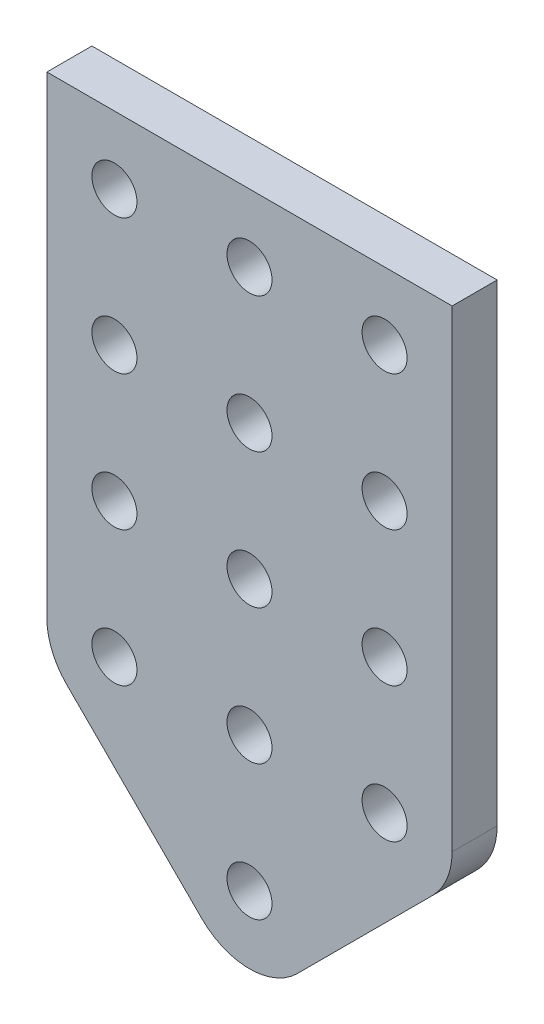
ISO-10303-21;
HEADER;
FILE_DESCRIPTION(('STEP AP214'),'2;1');
FILE_NAME('part.step','',(''),(''),'','','');
FILE_SCHEMA(('AUTOMOTIVE_DESIGN { 1 0 10303 214 1 1 1 1 }'));
ENDSEC;
DATA;
#1=APPLICATION_CONTEXT('core data for automotive mechanical design processes');
#2=APPLICATION_PROTOCOL_DEFINITION('international standard','automotive_design',2000,#1);
#3=PRODUCT_CONTEXT('',#1,'mechanical');
#4=PRODUCT('Part','Part','',(#3));
#5=PRODUCT_RELATED_PRODUCT_CATEGORY('part','',(#4));
#6=PRODUCT_DEFINITION_FORMATION('','',#4);
#7=PRODUCT_DEFINITION_CONTEXT('part definition',#1,'design');
#8=PRODUCT_DEFINITION('design','',#6,#7);
#9=PRODUCT_DEFINITION_SHAPE('','',#8);
#10=(LENGTH_UNIT() NAMED_UNIT(*) SI_UNIT(.MILLI.,.METRE.));
#11=(NAMED_UNIT(*) PLANE_ANGLE_UNIT() SI_UNIT($,.RADIAN.));
#12=(NAMED_UNIT(*) SI_UNIT($,.STERADIAN.) SOLID_ANGLE_UNIT());
#13=UNCERTAINTY_MEASURE_WITH_UNIT(LENGTH_MEASURE(1.E-05),#10,'distance_accuracy_value','');
#14=(GEOMETRIC_REPRESENTATION_CONTEXT(3) GLOBAL_UNCERTAINTY_ASSIGNED_CONTEXT((#13)) GLOBAL_UNIT_ASSIGNED_CONTEXT((#10,
#11,#12)) REPRESENTATION_CONTEXT('',''));
#15=CARTESIAN_POINT('',(0.,0.,0.));
#16=DIRECTION('',(0.,0.,1.));
#17=DIRECTION('',(1.,0.,0.));
#18=AXIS2_PLACEMENT_3D('',#15,#16,#17);
#19=CARTESIAN_POINT('',(187.7270545748,195.1787200631,3.));
#20=DIRECTION('',(0.,0.,1.));
#21=DIRECTION('',(1.,0.,0.));
#22=AXIS2_PLACEMENT_3D('',#19,#20,#21);
#23=PLANE('',#22);
#24=CARTESIAN_POINT('',(178.7270545748,231.1787200631,3.));
#25=DIRECTION('',(0.,0.,1.));
#26=DIRECTION('',(1.,0.,0.));
#27=AXIS2_PLACEMENT_3D('',#24,#25,#26);
#28=CIRCLE('',#27,1.5);
#29=CARTESIAN_POINT('',(180.2270545748,231.1787200631,3.));
#30=VERTEX_POINT('',#29);
#31=EDGE_CURVE('E242',#30,#30,#28,.T.);
#32=ORIENTED_EDGE('',*,*,#31,.F.);
#33=EDGE_LOOP('',(#32));
#34=FACE_BOUND('',#33,.T.);
#35=CARTESIAN_POINT('',(196.7270545748,222.1787200631,3.));
#36=DIRECTION('',(0.,0.,1.));
#37=DIRECTION('',(1.,0.,0.));
#38=AXIS2_PLACEMENT_3D('',#35,#36,#37);
#39=CIRCLE('',#38,1.5);
#40=CARTESIAN_POINT('',(198.2270545748,222.1787200631,3.));
#41=VERTEX_POINT('',#40);
#42=EDGE_CURVE('E230',#41,#41,#39,.T.);
#43=ORIENTED_EDGE('',*,*,#42,.F.);
#44=EDGE_LOOP('',(#43));
#45=FACE_BOUND('',#44,.T.);
#46=CARTESIAN_POINT('',(187.7270545748,222.1787200631,3.));
#47=DIRECTION('',(0.,0.,1.));
#48=DIRECTION('',(1.,0.,0.));
#49=AXIS2_PLACEMENT_3D('',#46,#47,#48);
#50=CIRCLE('',#49,1.5);
#51=CARTESIAN_POINT('',(189.2270545748,222.1787200631,3.));
#52=VERTEX_POINT('',#51);
#53=EDGE_CURVE('E218',#52,#52,#50,.T.);
#54=ORIENTED_EDGE('',*,*,#53,.F.);
#55=EDGE_LOOP('',(#54));
#56=FACE_BOUND('',#55,.T.);
#57=CARTESIAN_POINT('',(187.7270545748,195.1787200631,3.));
#58=DIRECTION('',(0.,0.,1.));
#59=DIRECTION('',(1.,0.,0.));
#60=AXIS2_PLACEMENT_3D('',#57,#58,#59);
#61=CIRCLE('',#60,1.5);
#62=CARTESIAN_POINT('',(189.2270545748,195.1787200631,3.));
#63=VERTEX_POINT('',#62);
#64=EDGE_CURVE('E206',#63,#63,#61,.T.);
#65=ORIENTED_EDGE('',*,*,#64,.F.);
#66=EDGE_LOOP('',(#65));
#67=FACE_BOUND('',#66,.T.);
#68=CARTESIAN_POINT('',(178.7270545748,213.1787200631,3.));
#69=DIRECTION('',(0.,0.,1.));
#70=DIRECTION('',(1.,0.,0.));
#71=AXIS2_PLACEMENT_3D('',#68,#69,#70);
#72=CIRCLE('',#71,1.5);
#73=CARTESIAN_POINT('',(180.2270545748,213.1787200631,3.));
#74=VERTEX_POINT('',#73);
#75=EDGE_CURVE('E194',#74,#74,#72,.T.);
#76=ORIENTED_EDGE('',*,*,#75,.F.);
#77=EDGE_LOOP('',(#76));
#78=FACE_BOUND('',#77,.T.);
#79=CARTESIAN_POINT('',(178.7270545748,204.1787200631,3.));
#80=DIRECTION('',(0.,0.,1.));
#81=DIRECTION('',(1.,0.,0.));
#82=AXIS2_PLACEMENT_3D('',#79,#80,#81);
#83=CIRCLE('',#82,1.5);
#84=CARTESIAN_POINT('',(180.2270545748,204.1787200631,3.));
#85=VERTEX_POINT('',#84);
#86=EDGE_CURVE('E182',#85,#85,#83,.T.);
#87=ORIENTED_EDGE('',*,*,#86,.F.);
#88=EDGE_LOOP('',(#87));
#89=FACE_BOUND('',#88,.T.);
#90=CARTESIAN_POINT('',(187.7270545748,195.1787200631,3.));
#91=DIRECTION('',(0.,0.,1.));
#92=DIRECTION('',(1.,0.,0.));
#93=AXIS2_PLACEMENT_3D('',#90,#91,#92);
#94=CIRCLE('',#93,4.50000000005025);
#95=CARTESIAN_POINT('',(184.5450740594,191.9967395477,3.));
#96=VERTEX_POINT('',#95);
#97=CARTESIAN_POINT('',(190.9090350901,191.9967395477,3.));
#98=VERTEX_POINT('',#97);
#99=EDGE_CURVE('E145',#96,#98,#94,.T.);
#100=ORIENTED_EDGE('',*,*,#99,.T.);
#101=DIRECTION('',(0.707106781186548,0.707106781186548,0.));
#102=VECTOR('',#101,1.);
#103=CARTESIAN_POINT('',(190.9090350901,191.9967395477,3.));
#104=LINE('',#103,#102);
#105=CARTESIAN_POINT('',(199.909035090095,200.996739547705,3.));
#106=VERTEX_POINT('',#105);
#107=EDGE_CURVE('E93',#98,#106,#104,.T.);
#108=ORIENTED_EDGE('',*,*,#107,.T.);
#109=CARTESIAN_POINT('',(196.7270545748,204.1787200631,3.));
#110=DIRECTION('',(0.,0.,1.));
#111=DIRECTION('',(1.,0.,0.));
#112=AXIS2_PLACEMENT_3D('',#109,#110,#111);
#113=CIRCLE('',#112,4.50000000000745);
#114=CARTESIAN_POINT('',(201.2270545748,204.1787200631,3.));
#115=VERTEX_POINT('',#114);
#116=EDGE_CURVE('E160',#106,#115,#113,.T.);
#117=ORIENTED_EDGE('',*,*,#116,.T.);
#118=DIRECTION('',(0.,1.,0.));
#119=VECTOR('',#118,1.);
#120=CARTESIAN_POINT('',(201.2270545748,235.6787200631,3.));
#121=LINE('',#120,#119);
#122=CARTESIAN_POINT('',(201.2270545748,235.6787200631,3.));
#123=VERTEX_POINT('',#122);
#124=EDGE_CURVE('E173',#115,#123,#121,.T.);
#125=ORIENTED_EDGE('',*,*,#124,.T.);
#126=DIRECTION('',(-1.,0.,0.));
#127=VECTOR('',#126,1.);
#128=CARTESIAN_POINT('',(201.2270545748,235.6787200631,3.));
#129=LINE('',#128,#127);
#130=CARTESIAN_POINT('',(174.2270545748,235.6787200631,3.));
#131=VERTEX_POINT('',#130);
#132=EDGE_CURVE('E112',#123,#131,#129,.T.);
#133=ORIENTED_EDGE('',*,*,#132,.T.);
#134=DIRECTION('',(0.,-1.,0.));
#135=VECTOR('',#134,1.);
#136=CARTESIAN_POINT('',(174.2270545748,213.1787200631,3.));
#137=LINE('',#136,#135);
#138=CARTESIAN_POINT('',(174.227054574757,204.1787200631,3.));
#139=VERTEX_POINT('',#138);
#140=EDGE_CURVE('E106',#131,#139,#137,.T.);
#141=ORIENTED_EDGE('',*,*,#140,.T.);
#142=CARTESIAN_POINT('',(178.7270545748,204.1787200631,3.));
#143=DIRECTION('',(0.,0.,1.));
#144=DIRECTION('',(1.,0.,0.));
#145=AXIS2_PLACEMENT_3D('',#142,#143,#144);
#146=CIRCLE('',#145,4.50000000004281);
#147=CARTESIAN_POINT('',(175.5450740594,200.9967395477,3.));
#148=VERTEX_POINT('',#147);
#149=EDGE_CURVE('E110',#139,#148,#146,.T.);
#150=ORIENTED_EDGE('',*,*,#149,.T.);
#151=DIRECTION('',(0.707106781186548,-0.707106781186548,0.));
#152=VECTOR('',#151,1.);
#153=CARTESIAN_POINT('',(184.5450740594,191.9967395477,3.));
#154=LINE('',#153,#152);
#155=EDGE_CURVE('E50',#148,#96,#154,.T.);
#156=ORIENTED_EDGE('',*,*,#155,.T.);
#157=EDGE_LOOP('',(#100,#108,#117,#125,#133,#141,#150,#156));
#158=FACE_BOUND('',#157,.T.);
#159=CARTESIAN_POINT('',(187.7270545748,204.1787200631,3.));
#160=DIRECTION('',(0.,0.,1.));
#161=DIRECTION('',(1.,0.,0.));
#162=AXIS2_PLACEMENT_3D('',#159,#160,#161);
#163=CIRCLE('',#162,1.5);
#164=CARTESIAN_POINT('',(189.2270545748,204.1787200631,3.));
#165=VERTEX_POINT('',#164);
#166=EDGE_CURVE('E133',#165,#165,#163,.T.);
#167=ORIENTED_EDGE('',*,*,#166,.F.);
#168=EDGE_LOOP('',(#167));
#169=FACE_BOUND('',#168,.T.);
#170=CARTESIAN_POINT('',(187.7270545748,213.1787200631,3.));
#171=DIRECTION('',(0.,0.,1.));
#172=DIRECTION('',(1.,0.,0.));
#173=AXIS2_PLACEMENT_3D('',#170,#171,#172);
#174=CIRCLE('',#173,1.5);
#175=CARTESIAN_POINT('',(189.2270545748,213.1787200631,3.));
#176=VERTEX_POINT('',#175);
#177=EDGE_CURVE('E188',#176,#176,#174,.T.);
#178=ORIENTED_EDGE('',*,*,#177,.F.);
#179=EDGE_LOOP('',(#178));
#180=FACE_BOUND('',#179,.T.);
#181=CARTESIAN_POINT('',(196.7270545748,213.1787200631,3.));
#182=DIRECTION('',(0.,0.,1.));
#183=DIRECTION('',(1.,0.,0.));
#184=AXIS2_PLACEMENT_3D('',#181,#182,#183);
#185=CIRCLE('',#184,1.5);
#186=CARTESIAN_POINT('',(198.2270545748,213.1787200631,3.));
#187=VERTEX_POINT('',#186);
#188=EDGE_CURVE('E200',#187,#187,#185,.T.);
#189=ORIENTED_EDGE('',*,*,#188,.F.);
#190=EDGE_LOOP('',(#189));
#191=FACE_BOUND('',#190,.T.);
#192=CARTESIAN_POINT('',(196.7270545748,204.1787200631,3.));
#193=DIRECTION('',(0.,0.,1.));
#194=DIRECTION('',(1.,0.,0.));
#195=AXIS2_PLACEMENT_3D('',#192,#193,#194);
#196=CIRCLE('',#195,1.5);
#197=CARTESIAN_POINT('',(198.2270545748,204.1787200631,3.));
#198=VERTEX_POINT('',#197);
#199=EDGE_CURVE('E212',#198,#198,#196,.T.);
#200=ORIENTED_EDGE('',*,*,#199,.F.);
#201=EDGE_LOOP('',(#200));
#202=FACE_BOUND('',#201,.T.);
#203=CARTESIAN_POINT('',(178.7270545748,222.1787200631,3.));
#204=DIRECTION('',(0.,0.,1.));
#205=DIRECTION('',(1.,0.,0.));
#206=AXIS2_PLACEMENT_3D('',#203,#204,#205);
#207=CIRCLE('',#206,1.5);
#208=CARTESIAN_POINT('',(180.2270545748,222.1787200631,3.));
#209=VERTEX_POINT('',#208);
#210=EDGE_CURVE('E224',#209,#209,#207,.T.);
#211=ORIENTED_EDGE('',*,*,#210,.F.);
#212=EDGE_LOOP('',(#211));
#213=FACE_BOUND('',#212,.T.);
#214=CARTESIAN_POINT('',(187.7270545748,231.1787200631,3.));
#215=DIRECTION('',(0.,0.,1.));
#216=DIRECTION('',(1.,0.,0.));
#217=AXIS2_PLACEMENT_3D('',#214,#215,#216);
#218=CIRCLE('',#217,1.5);
#219=CARTESIAN_POINT('',(189.2270545748,231.1787200631,3.));
#220=VERTEX_POINT('',#219);
#221=EDGE_CURVE('E236',#220,#220,#218,.T.);
#222=ORIENTED_EDGE('',*,*,#221,.F.);
#223=EDGE_LOOP('',(#222));
#224=FACE_BOUND('',#223,.T.);
#225=CARTESIAN_POINT('',(196.7270545748,231.1787200631,3.));
#226=DIRECTION('',(0.,0.,1.));
#227=DIRECTION('',(1.,0.,0.));
#228=AXIS2_PLACEMENT_3D('',#225,#226,#227);
#229=CIRCLE('',#228,1.5);
#230=CARTESIAN_POINT('',(198.2270545748,231.1787200631,3.));
#231=VERTEX_POINT('',#230);
#232=EDGE_CURVE('E248',#231,#231,#229,.T.);
#233=ORIENTED_EDGE('',*,*,#232,.F.);
#234=EDGE_LOOP('',(#233));
#235=FACE_BOUND('',#234,.T.);
#236=ADVANCED_FACE('F33',(#34,#45,#56,#67,#78,#89,#158,#169,#180,#191,#202,#213,#224,#235),#23,.T.);
#237=CARTESIAN_POINT('',(187.7270545748,195.1787200631,0.));
#238=DIRECTION('',(0.,0.,1.));
#239=DIRECTION('',(1.,0.,0.));
#240=AXIS2_PLACEMENT_3D('',#237,#238,#239);
#241=PLANE('',#240);
#242=CARTESIAN_POINT('',(178.7270545748,231.1787200631,0.));
#243=DIRECTION('',(0.,0.,1.));
#244=DIRECTION('',(1.,0.,0.));
#245=AXIS2_PLACEMENT_3D('',#242,#243,#244);
#246=CIRCLE('',#245,1.5);
#247=CARTESIAN_POINT('',(180.2270545748,231.1787200631,0.));
#248=VERTEX_POINT('',#247);
#249=EDGE_CURVE('E245',#248,#248,#246,.T.);
#250=ORIENTED_EDGE('',*,*,#249,.T.);
#251=EDGE_LOOP('',(#250));
#252=FACE_BOUND('',#251,.T.);
#253=CARTESIAN_POINT('',(196.7270545748,222.1787200631,0.));
#254=DIRECTION('',(0.,0.,1.));
#255=DIRECTION('',(1.,0.,0.));
#256=AXIS2_PLACEMENT_3D('',#253,#254,#255);
#257=CIRCLE('',#256,1.5);
#258=CARTESIAN_POINT('',(198.2270545748,222.1787200631,0.));
#259=VERTEX_POINT('',#258);
#260=EDGE_CURVE('E233',#259,#259,#257,.T.);
#261=ORIENTED_EDGE('',*,*,#260,.T.);
#262=EDGE_LOOP('',(#261));
#263=FACE_BOUND('',#262,.T.);
#264=CARTESIAN_POINT('',(187.7270545748,222.1787200631,0.));
#265=DIRECTION('',(0.,0.,1.));
#266=DIRECTION('',(1.,0.,0.));
#267=AXIS2_PLACEMENT_3D('',#264,#265,#266);
#268=CIRCLE('',#267,1.5);
#269=CARTESIAN_POINT('',(189.2270545748,222.1787200631,0.));
#270=VERTEX_POINT('',#269);
#271=EDGE_CURVE('E221',#270,#270,#268,.T.);
#272=ORIENTED_EDGE('',*,*,#271,.T.);
#273=EDGE_LOOP('',(#272));
#274=FACE_BOUND('',#273,.T.);
#275=CARTESIAN_POINT('',(187.7270545748,195.1787200631,0.));
#276=DIRECTION('',(0.,0.,1.));
#277=DIRECTION('',(1.,0.,0.));
#278=AXIS2_PLACEMENT_3D('',#275,#276,#277);
#279=CIRCLE('',#278,1.5);
#280=CARTESIAN_POINT('',(189.2270545748,195.1787200631,0.));
#281=VERTEX_POINT('',#280);
#282=EDGE_CURVE('E209',#281,#281,#279,.T.);
#283=ORIENTED_EDGE('',*,*,#282,.T.);
#284=EDGE_LOOP('',(#283));
#285=FACE_BOUND('',#284,.T.);
#286=CARTESIAN_POINT('',(178.7270545748,213.1787200631,0.));
#287=DIRECTION('',(0.,0.,1.));
#288=DIRECTION('',(1.,0.,0.));
#289=AXIS2_PLACEMENT_3D('',#286,#287,#288);
#290=CIRCLE('',#289,1.5);
#291=CARTESIAN_POINT('',(180.2270545748,213.1787200631,0.));
#292=VERTEX_POINT('',#291);
#293=EDGE_CURVE('E197',#292,#292,#290,.T.);
#294=ORIENTED_EDGE('',*,*,#293,.T.);
#295=EDGE_LOOP('',(#294));
#296=FACE_BOUND('',#295,.T.);
#297=CARTESIAN_POINT('',(178.7270545748,204.1787200631,0.));
#298=DIRECTION('',(0.,0.,1.));
#299=DIRECTION('',(1.,0.,0.));
#300=AXIS2_PLACEMENT_3D('',#297,#298,#299);
#301=CIRCLE('',#300,1.5);
#302=CARTESIAN_POINT('',(180.2270545748,204.1787200631,0.));
#303=VERTEX_POINT('',#302);
#304=EDGE_CURVE('E185',#303,#303,#301,.T.);
#305=ORIENTED_EDGE('',*,*,#304,.T.);
#306=EDGE_LOOP('',(#305));
#307=FACE_BOUND('',#306,.T.);
#308=CARTESIAN_POINT('',(187.7270545748,195.1787200631,0.));
#309=DIRECTION('',(0.,0.,1.));
#310=DIRECTION('',(1.,0.,0.));
#311=AXIS2_PLACEMENT_3D('',#308,#309,#310);
#312=CIRCLE('',#311,4.50000000005025);
#313=CARTESIAN_POINT('',(184.5450740594,191.9967395477,0.));
#314=VERTEX_POINT('',#313);
#315=CARTESIAN_POINT('',(190.9090350901,191.9967395477,0.));
#316=VERTEX_POINT('',#315);
#317=EDGE_CURVE('E129',#314,#316,#312,.T.);
#318=ORIENTED_EDGE('',*,*,#317,.F.);
#319=DIRECTION('',(0.707106781186548,-0.707106781186548,0.));
#320=VECTOR('',#319,1.);
#321=CARTESIAN_POINT('',(184.5450740594,191.9967395477,0.));
#322=LINE('',#321,#320);
#323=CARTESIAN_POINT('',(175.5450740594,200.9967395477,0.));
#324=VERTEX_POINT('',#323);
#325=EDGE_CURVE('E85',#324,#314,#322,.T.);
#326=ORIENTED_EDGE('',*,*,#325,.F.);
#327=CARTESIAN_POINT('',(178.7270545748,204.1787200631,0.));
#328=DIRECTION('',(0.,0.,1.));
#329=DIRECTION('',(1.,0.,0.));
#330=AXIS2_PLACEMENT_3D('',#327,#328,#329);
#331=CIRCLE('',#330,4.50000000004281);
#332=CARTESIAN_POINT('',(174.227054574757,204.1787200631,0.));
#333=VERTEX_POINT('',#332);
#334=EDGE_CURVE('E79',#333,#324,#331,.T.);
#335=ORIENTED_EDGE('',*,*,#334,.F.);
#336=DIRECTION('',(0.,-1.,0.));
#337=VECTOR('',#336,1.);
#338=CARTESIAN_POINT('',(174.2270545748,213.1787200631,0.));
#339=LINE('',#338,#337);
#340=CARTESIAN_POINT('',(174.2270545748,235.6787200631,0.));
#341=VERTEX_POINT('',#340);
#342=EDGE_CURVE('E119',#341,#333,#339,.T.);
#343=ORIENTED_EDGE('',*,*,#342,.F.);
#344=DIRECTION('',(-1.,0.,0.));
#345=VECTOR('',#344,1.);
#346=CARTESIAN_POINT('',(201.2270545748,235.6787200631,0.));
#347=LINE('',#346,#345);
#348=CARTESIAN_POINT('',(201.2270545748,235.6787200631,0.));
#349=VERTEX_POINT('',#348);
#350=EDGE_CURVE('E139',#349,#341,#347,.T.);
#351=ORIENTED_EDGE('',*,*,#350,.F.);
#352=DIRECTION('',(0.,1.,0.));
#353=VECTOR('',#352,1.);
#354=CARTESIAN_POINT('',(201.2270545748,235.6787200631,0.));
#355=LINE('',#354,#353);
#356=CARTESIAN_POINT('',(201.2270545748,204.1787200631,0.));
#357=VERTEX_POINT('',#356);
#358=EDGE_CURVE('E137',#357,#349,#355,.T.);
#359=ORIENTED_EDGE('',*,*,#358,.F.);
#360=CARTESIAN_POINT('',(196.7270545748,204.1787200631,0.));
#361=DIRECTION('',(0.,0.,1.));
#362=DIRECTION('',(1.,0.,0.));
#363=AXIS2_PLACEMENT_3D('',#360,#361,#362);
#364=CIRCLE('',#363,4.50000000000745);
#365=CARTESIAN_POINT('',(199.909035090095,200.996739547705,0.));
#366=VERTEX_POINT('',#365);
#367=EDGE_CURVE('E135',#366,#357,#364,.T.);
#368=ORIENTED_EDGE('',*,*,#367,.F.);
#369=DIRECTION('',(0.707106781186548,0.707106781186548,0.));
#370=VECTOR('',#369,1.);
#371=CARTESIAN_POINT('',(190.9090350901,191.9967395477,0.));
#372=LINE('',#371,#370);
#373=EDGE_CURVE('E132',#316,#366,#372,.T.);
#374=ORIENTED_EDGE('',*,*,#373,.F.);
#375=EDGE_LOOP('',(#318,#326,#335,#343,#351,#359,#368,#374));
#376=FACE_BOUND('',#375,.T.);
#377=CARTESIAN_POINT('',(187.7270545748,204.1787200631,0.));
#378=DIRECTION('',(0.,0.,1.));
#379=DIRECTION('',(1.,0.,0.));
#380=AXIS2_PLACEMENT_3D('',#377,#378,#379);
#381=CIRCLE('',#380,1.5);
#382=CARTESIAN_POINT('',(189.2270545748,204.1787200631,0.));
#383=VERTEX_POINT('',#382);
#384=EDGE_CURVE('E179',#383,#383,#381,.T.);
#385=ORIENTED_EDGE('',*,*,#384,.T.);
#386=EDGE_LOOP('',(#385));
#387=FACE_BOUND('',#386,.T.);
#388=CARTESIAN_POINT('',(187.7270545748,213.1787200631,0.));
#389=DIRECTION('',(0.,0.,1.));
#390=DIRECTION('',(1.,0.,0.));
#391=AXIS2_PLACEMENT_3D('',#388,#389,#390);
#392=CIRCLE('',#391,1.5);
#393=CARTESIAN_POINT('',(189.2270545748,213.1787200631,0.));
#394=VERTEX_POINT('',#393);
#395=EDGE_CURVE('E191',#394,#394,#392,.T.);
#396=ORIENTED_EDGE('',*,*,#395,.T.);
#397=EDGE_LOOP('',(#396));
#398=FACE_BOUND('',#397,.T.);
#399=CARTESIAN_POINT('',(196.7270545748,213.1787200631,0.));
#400=DIRECTION('',(0.,0.,1.));
#401=DIRECTION('',(1.,0.,0.));
#402=AXIS2_PLACEMENT_3D('',#399,#400,#401);
#403=CIRCLE('',#402,1.5);
#404=CARTESIAN_POINT('',(198.2270545748,213.1787200631,0.));
#405=VERTEX_POINT('',#404);
#406=EDGE_CURVE('E203',#405,#405,#403,.T.);
#407=ORIENTED_EDGE('',*,*,#406,.T.);
#408=EDGE_LOOP('',(#407));
#409=FACE_BOUND('',#408,.T.);
#410=CARTESIAN_POINT('',(196.7270545748,204.1787200631,0.));
#411=DIRECTION('',(0.,0.,1.));
#412=DIRECTION('',(1.,0.,0.));
#413=AXIS2_PLACEMENT_3D('',#410,#411,#412);
#414=CIRCLE('',#413,1.5);
#415=CARTESIAN_POINT('',(198.2270545748,204.1787200631,0.));
#416=VERTEX_POINT('',#415);
#417=EDGE_CURVE('E215',#416,#416,#414,.T.);
#418=ORIENTED_EDGE('',*,*,#417,.T.);
#419=EDGE_LOOP('',(#418));
#420=FACE_BOUND('',#419,.T.);
#421=CARTESIAN_POINT('',(178.7270545748,222.1787200631,0.));
#422=DIRECTION('',(0.,0.,1.));
#423=DIRECTION('',(1.,0.,0.));
#424=AXIS2_PLACEMENT_3D('',#421,#422,#423);
#425=CIRCLE('',#424,1.5);
#426=CARTESIAN_POINT('',(180.2270545748,222.1787200631,0.));
#427=VERTEX_POINT('',#426);
#428=EDGE_CURVE('E227',#427,#427,#425,.T.);
#429=ORIENTED_EDGE('',*,*,#428,.T.);
#430=EDGE_LOOP('',(#429));
#431=FACE_BOUND('',#430,.T.);
#432=CARTESIAN_POINT('',(187.7270545748,231.1787200631,0.));
#433=DIRECTION('',(0.,0.,1.));
#434=DIRECTION('',(1.,0.,0.));
#435=AXIS2_PLACEMENT_3D('',#432,#433,#434);
#436=CIRCLE('',#435,1.5);
#437=CARTESIAN_POINT('',(189.2270545748,231.1787200631,0.));
#438=VERTEX_POINT('',#437);
#439=EDGE_CURVE('E239',#438,#438,#436,.T.);
#440=ORIENTED_EDGE('',*,*,#439,.T.);
#441=EDGE_LOOP('',(#440));
#442=FACE_BOUND('',#441,.T.);
#443=CARTESIAN_POINT('',(196.7270545748,231.1787200631,0.));
#444=DIRECTION('',(0.,0.,1.));
#445=DIRECTION('',(1.,0.,0.));
#446=AXIS2_PLACEMENT_3D('',#443,#444,#445);
#447=CIRCLE('',#446,1.5);
#448=CARTESIAN_POINT('',(198.2270545748,231.1787200631,0.));
#449=VERTEX_POINT('',#448);
#450=EDGE_CURVE('E251',#449,#449,#447,.T.);
#451=ORIENTED_EDGE('',*,*,#450,.T.);
#452=EDGE_LOOP('',(#451));
#453=FACE_BOUND('',#452,.T.);
#454=ADVANCED_FACE('F164',(#252,#263,#274,#285,#296,#307,#376,#387,#398,#409,#420,#431,#442,
#453),#241,.F.);
#455=CARTESIAN_POINT('',(187.7270545748,195.1787200631,3.));
#456=DIRECTION('',(0.,0.,-1.));
#457=DIRECTION('',(-1.,0.,0.));
#458=AXIS2_PLACEMENT_3D('',#455,#456,#457);
#459=CYLINDRICAL_SURFACE('',#458,4.50000000005025);
#460=ORIENTED_EDGE('',*,*,#317,.T.);
#461=DIRECTION('',(0.,0.,-1.));
#462=VECTOR('',#461,1.);
#463=CARTESIAN_POINT('',(190.9090350901,191.9967395477,3.));
#464=LINE('',#463,#462);
#465=EDGE_CURVE('E11',#98,#316,#464,.T.);
#466=ORIENTED_EDGE('',*,*,#465,.F.);
#467=ORIENTED_EDGE('',*,*,#99,.F.);
#468=DIRECTION('',(0.,0.,-1.));
#469=VECTOR('',#468,1.);
#470=CARTESIAN_POINT('',(184.5450740594,191.9967395477,3.));
#471=LINE('',#470,#469);
#472=EDGE_CURVE('E125',#96,#314,#471,.T.);
#473=ORIENTED_EDGE('',*,*,#472,.T.);
#474=EDGE_LOOP('',(#460,#466,#467,#473));
#475=FACE_BOUND('',#474,.T.);
#476=ADVANCED_FACE('F35',(#475),#459,.T.);
#477=CARTESIAN_POINT('',(190.9090350901,191.9967395477,3.));
#478=DIRECTION('',(-0.707106781186547,0.707106781186547,0.));
#479=DIRECTION('',(-0.707106781186548,-0.707106781186548,0.));
#480=AXIS2_PLACEMENT_3D('',#477,#478,#479);
#481=PLANE('',#480);
#482=ORIENTED_EDGE('',*,*,#373,.T.);
#483=DIRECTION('',(0.,0.,-1.));
#484=VECTOR('',#483,1.);
#485=CARTESIAN_POINT('',(199.909035090095,200.996739547705,3.));
#486=LINE('',#485,#484);
#487=EDGE_CURVE('E42',#106,#366,#486,.T.);
#488=ORIENTED_EDGE('',*,*,#487,.F.);
#489=ORIENTED_EDGE('',*,*,#107,.F.);
#490=ORIENTED_EDGE('',*,*,#465,.T.);
#491=EDGE_LOOP('',(#482,#488,#489,#490));
#492=FACE_BOUND('',#491,.T.);
#493=ADVANCED_FACE('F286',(#492),#481,.F.);
#494=CARTESIAN_POINT('',(196.7270545748,204.1787200631,3.));
#495=DIRECTION('',(0.,0.,-1.));
#496=DIRECTION('',(-1.,0.,0.));
#497=AXIS2_PLACEMENT_3D('',#494,#495,#496);
#498=CYLINDRICAL_SURFACE('',#497,4.50000000000745);
#499=ORIENTED_EDGE('',*,*,#367,.T.);
#500=DIRECTION('',(0.,0.,-1.));
#501=VECTOR('',#500,1.);
#502=CARTESIAN_POINT('',(201.2270545748,204.1787200631,3.));
#503=LINE('',#502,#501);
#504=EDGE_CURVE('E152',#115,#357,#503,.T.);
#505=ORIENTED_EDGE('',*,*,#504,.F.);
#506=ORIENTED_EDGE('',*,*,#116,.F.);
#507=ORIENTED_EDGE('',*,*,#487,.T.);
#508=EDGE_LOOP('',(#499,#505,#506,#507));
#509=FACE_BOUND('',#508,.T.);
#510=ADVANCED_FACE('F158',(#509),#498,.T.);
#511=CARTESIAN_POINT('',(201.2270545748,235.6787200631,3.));
#512=DIRECTION('',(-1.,0.,0.));
#513=DIRECTION('',(0.,0.,1.));
#514=AXIS2_PLACEMENT_3D('',#511,#512,#513);
#515=PLANE('',#514);
#516=ORIENTED_EDGE('',*,*,#358,.T.);
#517=DIRECTION('',(0.,0.,-1.));
#518=VECTOR('',#517,1.);
#519=CARTESIAN_POINT('',(201.2270545748,235.6787200631,3.));
#520=LINE('',#519,#518);
#521=EDGE_CURVE('E149',#123,#349,#520,.T.);
#522=ORIENTED_EDGE('',*,*,#521,.F.);
#523=ORIENTED_EDGE('',*,*,#124,.F.);
#524=ORIENTED_EDGE('',*,*,#504,.T.);
#525=EDGE_LOOP('',(#516,#522,#523,#524));
#526=FACE_BOUND('',#525,.T.);
#527=ADVANCED_FACE('F169',(#526),#515,.F.);
#528=CARTESIAN_POINT('',(201.2270545748,235.6787200631,3.));
#529=DIRECTION('',(0.,-1.,0.));
#530=DIRECTION('',(0.,0.,-1.));
#531=AXIS2_PLACEMENT_3D('',#528,#529,#530);
#532=PLANE('',#531);
#533=ORIENTED_EDGE('',*,*,#350,.T.);
#534=DIRECTION('',(0.,0.,-1.));
#535=VECTOR('',#534,1.);
#536=CARTESIAN_POINT('',(174.2270545748,235.6787200631,3.));
#537=LINE('',#536,#535);
#538=EDGE_CURVE('E120',#131,#341,#537,.T.);
#539=ORIENTED_EDGE('',*,*,#538,.F.);
#540=ORIENTED_EDGE('',*,*,#132,.F.);
#541=ORIENTED_EDGE('',*,*,#521,.T.);
#542=EDGE_LOOP('',(#533,#539,#540,#541));
#543=FACE_BOUND('',#542,.T.);
#544=ADVANCED_FACE('F172',(#543),#532,.F.);
#545=CARTESIAN_POINT('',(174.2270545748,213.1787200631,3.));
#546=DIRECTION('',(1.,0.,0.));
#547=DIRECTION('',(0.,0.,-1.));
#548=AXIS2_PLACEMENT_3D('',#545,#546,#547);
#549=PLANE('',#548);
#550=ORIENTED_EDGE('',*,*,#342,.T.);
#551=DIRECTION('',(0.,0.,-1.));
#552=VECTOR('',#551,1.);
#553=CARTESIAN_POINT('',(174.227054574757,204.1787200631,3.));
#554=LINE('',#553,#552);
#555=EDGE_CURVE('E117',#139,#333,#554,.T.);
#556=ORIENTED_EDGE('',*,*,#555,.F.);
#557=ORIENTED_EDGE('',*,*,#140,.F.);
#558=ORIENTED_EDGE('',*,*,#538,.T.);
#559=EDGE_LOOP('',(#550,#556,#557,#558));
#560=FACE_BOUND('',#559,.T.);
#561=ADVANCED_FACE('F118',(#560),#549,.F.);
#562=CARTESIAN_POINT('',(178.7270545748,204.1787200631,3.));
#563=DIRECTION('',(0.,0.,-1.));
#564=DIRECTION('',(-1.,0.,0.));
#565=AXIS2_PLACEMENT_3D('',#562,#563,#564);
#566=CYLINDRICAL_SURFACE('',#565,4.50000000004281);
#567=ORIENTED_EDGE('',*,*,#334,.T.);
#568=DIRECTION('',(0.,0.,-1.));
#569=VECTOR('',#568,1.);
#570=CARTESIAN_POINT('',(175.5450740594,200.9967395477,3.));
#571=LINE('',#570,#569);
#572=EDGE_CURVE('E121',#148,#324,#571,.T.);
#573=ORIENTED_EDGE('',*,*,#572,.F.);
#574=ORIENTED_EDGE('',*,*,#149,.F.);
#575=ORIENTED_EDGE('',*,*,#555,.T.);
#576=EDGE_LOOP('',(#567,#573,#574,#575));
#577=FACE_BOUND('',#576,.T.);
#578=ADVANCED_FACE('F123',(#577),#566,.T.);
#579=CARTESIAN_POINT('',(184.5450740594,191.9967395477,3.));
#580=DIRECTION('',(0.707106781186547,0.707106781186547,0.));
#581=DIRECTION('',(-0.707106781186548,0.707106781186548,0.));
#582=AXIS2_PLACEMENT_3D('',#579,#580,#581);
#583=PLANE('',#582);
#584=ORIENTED_EDGE('',*,*,#325,.T.);
#585=ORIENTED_EDGE('',*,*,#472,.F.);
#586=ORIENTED_EDGE('',*,*,#155,.F.);
#587=ORIENTED_EDGE('',*,*,#572,.T.);
#588=EDGE_LOOP('',(#584,#585,#586,#587));
#589=FACE_BOUND('',#588,.T.);
#590=ADVANCED_FACE('F274',(#589),#583,.F.);
#591=CARTESIAN_POINT('',(187.7270545748,204.1787200631,3.));
#592=DIRECTION('',(0.,0.,-1.));
#593=DIRECTION('',(-1.,0.,0.));
#594=AXIS2_PLACEMENT_3D('',#591,#592,#593);
#595=CYLINDRICAL_SURFACE('',#594,1.5);
#596=ORIENTED_EDGE('',*,*,#166,.T.);
#597=EDGE_LOOP('',(#596));
#598=FACE_BOUND('',#597,.T.);
#599=ORIENTED_EDGE('',*,*,#384,.F.);
#600=EDGE_LOOP('',(#599));
#601=FACE_BOUND('',#600,.T.);
#602=ADVANCED_FACE('F271',(#598,#601),#595,.F.);
#603=CARTESIAN_POINT('',(178.7270545748,204.1787200631,3.));
#604=DIRECTION('',(0.,0.,-1.));
#605=DIRECTION('',(-1.,0.,0.));
#606=AXIS2_PLACEMENT_3D('',#603,#604,#605);
#607=CYLINDRICAL_SURFACE('',#606,1.5);
#608=ORIENTED_EDGE('',*,*,#86,.T.);
#609=EDGE_LOOP('',(#608));
#610=FACE_BOUND('',#609,.T.);
#611=ORIENTED_EDGE('',*,*,#304,.F.);
#612=EDGE_LOOP('',(#611));
#613=FACE_BOUND('',#612,.T.);
#614=ADVANCED_FACE('F353',(#610,#613),#607,.F.);
#615=CARTESIAN_POINT('',(187.7270545748,213.1787200631,3.));
#616=DIRECTION('',(0.,0.,-1.));
#617=DIRECTION('',(-1.,0.,0.));
#618=AXIS2_PLACEMENT_3D('',#615,#616,#617);
#619=CYLINDRICAL_SURFACE('',#618,1.5);
#620=ORIENTED_EDGE('',*,*,#177,.T.);
#621=EDGE_LOOP('',(#620));
#622=FACE_BOUND('',#621,.T.);
#623=ORIENTED_EDGE('',*,*,#395,.F.);
#624=EDGE_LOOP('',(#623));
#625=FACE_BOUND('',#624,.T.);
#626=ADVANCED_FACE('F361',(#622,#625),#619,.F.);
#627=CARTESIAN_POINT('',(178.7270545748,213.1787200631,3.));
#628=DIRECTION('',(0.,0.,-1.));
#629=DIRECTION('',(-1.,0.,0.));
#630=AXIS2_PLACEMENT_3D('',#627,#628,#629);
#631=CYLINDRICAL_SURFACE('',#630,1.5);
#632=ORIENTED_EDGE('',*,*,#75,.T.);
#633=EDGE_LOOP('',(#632));
#634=FACE_BOUND('',#633,.T.);
#635=ORIENTED_EDGE('',*,*,#293,.F.);
#636=EDGE_LOOP('',(#635));
#637=FACE_BOUND('',#636,.T.);
#638=ADVANCED_FACE('F369',(#634,#637),#631,.F.);
#639=CARTESIAN_POINT('',(196.7270545748,213.1787200631,3.));
#640=DIRECTION('',(0.,0.,-1.));
#641=DIRECTION('',(-1.,0.,0.));
#642=AXIS2_PLACEMENT_3D('',#639,#640,#641);
#643=CYLINDRICAL_SURFACE('',#642,1.5);
#644=ORIENTED_EDGE('',*,*,#188,.T.);
#645=EDGE_LOOP('',(#644));
#646=FACE_BOUND('',#645,.T.);
#647=ORIENTED_EDGE('',*,*,#406,.F.);
#648=EDGE_LOOP('',(#647));
#649=FACE_BOUND('',#648,.T.);
#650=ADVANCED_FACE('F378',(#646,#649),#643,.F.);
#651=CARTESIAN_POINT('',(187.7270545748,195.1787200631,3.));
#652=DIRECTION('',(0.,0.,-1.));
#653=DIRECTION('',(-1.,0.,0.));
#654=AXIS2_PLACEMENT_3D('',#651,#652,#653);
#655=CYLINDRICAL_SURFACE('',#654,1.5);
#656=ORIENTED_EDGE('',*,*,#64,.T.);
#657=EDGE_LOOP('',(#656));
#658=FACE_BOUND('',#657,.T.);
#659=ORIENTED_EDGE('',*,*,#282,.F.);
#660=EDGE_LOOP('',(#659));
#661=FACE_BOUND('',#660,.T.);
#662=ADVANCED_FACE('F387',(#658,#661),#655,.F.);
#663=CARTESIAN_POINT('',(196.7270545748,204.1787200631,3.));
#664=DIRECTION('',(0.,0.,-1.));
#665=DIRECTION('',(-1.,0.,0.));
#666=AXIS2_PLACEMENT_3D('',#663,#664,#665);
#667=CYLINDRICAL_SURFACE('',#666,1.5);
#668=ORIENTED_EDGE('',*,*,#199,.T.);
#669=EDGE_LOOP('',(#668));
#670=FACE_BOUND('',#669,.T.);
#671=ORIENTED_EDGE('',*,*,#417,.F.);
#672=EDGE_LOOP('',(#671));
#673=FACE_BOUND('',#672,.T.);
#674=ADVANCED_FACE('F396',(#670,#673),#667,.F.);
#675=CARTESIAN_POINT('',(187.7270545748,222.1787200631,3.));
#676=DIRECTION('',(0.,0.,-1.));
#677=DIRECTION('',(-1.,0.,0.));
#678=AXIS2_PLACEMENT_3D('',#675,#676,#677);
#679=CYLINDRICAL_SURFACE('',#678,1.5);
#680=ORIENTED_EDGE('',*,*,#53,.T.);
#681=EDGE_LOOP('',(#680));
#682=FACE_BOUND('',#681,.T.);
#683=ORIENTED_EDGE('',*,*,#271,.F.);
#684=EDGE_LOOP('',(#683));
#685=FACE_BOUND('',#684,.T.);
#686=ADVANCED_FACE('F405',(#682,#685),#679,.F.);
#687=CARTESIAN_POINT('',(178.7270545748,222.1787200631,3.));
#688=DIRECTION('',(0.,0.,-1.));
#689=DIRECTION('',(-1.,0.,0.));
#690=AXIS2_PLACEMENT_3D('',#687,#688,#689);
#691=CYLINDRICAL_SURFACE('',#690,1.5);
#692=ORIENTED_EDGE('',*,*,#210,.T.);
#693=EDGE_LOOP('',(#692));
#694=FACE_BOUND('',#693,.T.);
#695=ORIENTED_EDGE('',*,*,#428,.F.);
#696=EDGE_LOOP('',(#695));
#697=FACE_BOUND('',#696,.T.);
#698=ADVANCED_FACE('F414',(#694,#697),#691,.F.);
#699=CARTESIAN_POINT('',(196.7270545748,222.1787200631,3.));
#700=DIRECTION('',(0.,0.,-1.));
#701=DIRECTION('',(-1.,0.,0.));
#702=AXIS2_PLACEMENT_3D('',#699,#700,#701);
#703=CYLINDRICAL_SURFACE('',#702,1.5);
#704=ORIENTED_EDGE('',*,*,#42,.T.);
#705=EDGE_LOOP('',(#704));
#706=FACE_BOUND('',#705,.T.);
#707=ORIENTED_EDGE('',*,*,#260,.F.);
#708=EDGE_LOOP('',(#707));
#709=FACE_BOUND('',#708,.T.);
#710=ADVANCED_FACE('F423',(#706,#709),#703,.F.);
#711=CARTESIAN_POINT('',(187.7270545748,231.1787200631,3.));
#712=DIRECTION('',(0.,0.,-1.));
#713=DIRECTION('',(-1.,0.,0.));
#714=AXIS2_PLACEMENT_3D('',#711,#712,#713);
#715=CYLINDRICAL_SURFACE('',#714,1.5);
#716=ORIENTED_EDGE('',*,*,#221,.T.);
#717=EDGE_LOOP('',(#716));
#718=FACE_BOUND('',#717,.T.);
#719=ORIENTED_EDGE('',*,*,#439,.F.);
#720=EDGE_LOOP('',(#719));
#721=FACE_BOUND('',#720,.T.);
#722=ADVANCED_FACE('F432',(#718,#721),#715,.F.);
#723=CARTESIAN_POINT('',(178.7270545748,231.1787200631,3.));
#724=DIRECTION('',(0.,0.,-1.));
#725=DIRECTION('',(-1.,0.,0.));
#726=AXIS2_PLACEMENT_3D('',#723,#724,#725);
#727=CYLINDRICAL_SURFACE('',#726,1.5);
#728=ORIENTED_EDGE('',*,*,#31,.T.);
#729=EDGE_LOOP('',(#728));
#730=FACE_BOUND('',#729,.T.);
#731=ORIENTED_EDGE('',*,*,#249,.F.);
#732=EDGE_LOOP('',(#731));
#733=FACE_BOUND('',#732,.T.);
#734=ADVANCED_FACE('F441',(#730,#733),#727,.F.);
#735=CARTESIAN_POINT('',(196.7270545748,231.1787200631,3.));
#736=DIRECTION('',(0.,0.,-1.));
#737=DIRECTION('',(-1.,0.,0.));
#738=AXIS2_PLACEMENT_3D('',#735,#736,#737);
#739=CYLINDRICAL_SURFACE('',#738,1.5);
#740=ORIENTED_EDGE('',*,*,#232,.T.);
#741=EDGE_LOOP('',(#740));
#742=FACE_BOUND('',#741,.T.);
#743=ORIENTED_EDGE('',*,*,#450,.F.);
#744=EDGE_LOOP('',(#743));
#745=FACE_BOUND('',#744,.T.);
#746=ADVANCED_FACE('F257',(#742,#745),#739,.F.);
#747=CLOSED_SHELL('',(#236,#454,#476,#493,#510,#527,#544,#561,#578,#590,#602,#614,#626,#638,
#650,#662,#674,#686,#698,#710,#722,#734,#746));
#748=MANIFOLD_SOLID_BREP('B2',#747);
#749=ADVANCED_BREP_SHAPE_REPRESENTATION('',(#18,#748),#14);
#750=SHAPE_DEFINITION_REPRESENTATION(#9,#749);
ENDSEC;
END-ISO-10303-21;
